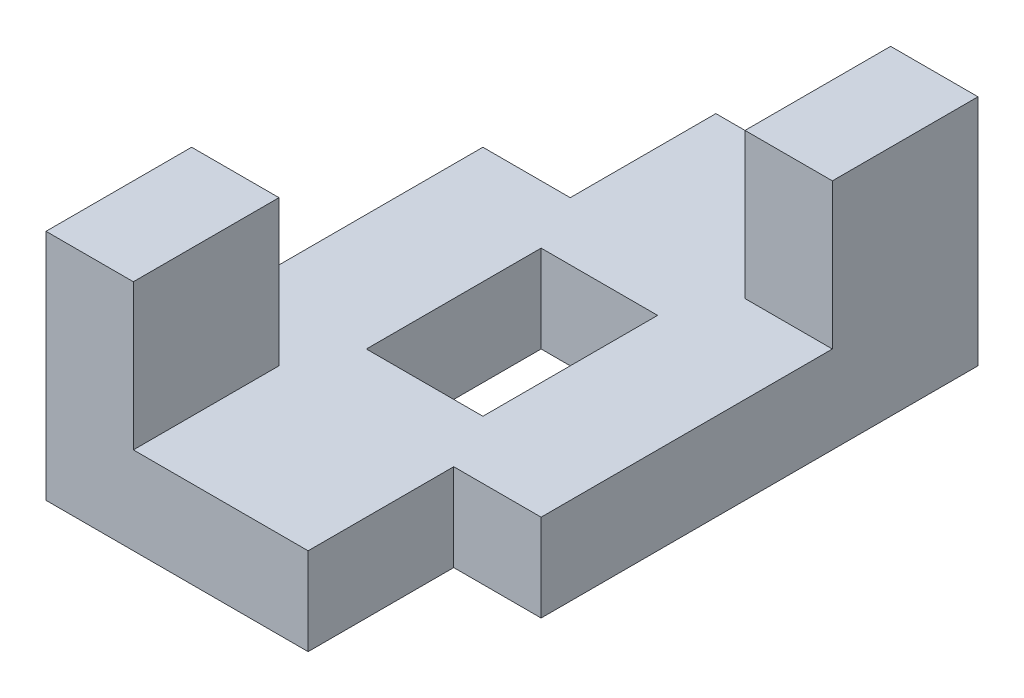
ISO-10303-21;
HEADER;
FILE_DESCRIPTION(('STEP AP214'),'2;1');
FILE_NAME('part.step','',(''),(''),'','','');
FILE_SCHEMA(('AUTOMOTIVE_DESIGN { 1 0 10303 214 1 1 1 1 }'));
ENDSEC;
DATA;
#1=APPLICATION_CONTEXT('core data for automotive mechanical design processes');
#2=APPLICATION_PROTOCOL_DEFINITION('international standard','automotive_design',2000,#1);
#3=PRODUCT_CONTEXT('',#1,'mechanical');
#4=PRODUCT('Part','Part','',(#3));
#5=PRODUCT_RELATED_PRODUCT_CATEGORY('part','',(#4));
#6=PRODUCT_DEFINITION_FORMATION('','',#4);
#7=PRODUCT_DEFINITION_CONTEXT('part definition',#1,'design');
#8=PRODUCT_DEFINITION('design','',#6,#7);
#9=PRODUCT_DEFINITION_SHAPE('','',#8);
#10=(LENGTH_UNIT() NAMED_UNIT(*) SI_UNIT(.MILLI.,.METRE.));
#11=(NAMED_UNIT(*) PLANE_ANGLE_UNIT() SI_UNIT($,.RADIAN.));
#12=(NAMED_UNIT(*) SI_UNIT($,.STERADIAN.) SOLID_ANGLE_UNIT());
#13=UNCERTAINTY_MEASURE_WITH_UNIT(LENGTH_MEASURE(1.E-05),#10,'distance_accuracy_value','');
#14=(GEOMETRIC_REPRESENTATION_CONTEXT(3) GLOBAL_UNCERTAINTY_ASSIGNED_CONTEXT((#13)) GLOBAL_UNIT_ASSIGNED_CONTEXT((#10,
#11,#12)) REPRESENTATION_CONTEXT('',''));
#15=CARTESIAN_POINT('',(0.,0.,0.));
#16=DIRECTION('',(0.,0.,1.));
#17=DIRECTION('',(1.,0.,0.));
#18=AXIS2_PLACEMENT_3D('',#15,#16,#17);
#19=CARTESIAN_POINT('',(15.,15.,0.));
#20=DIRECTION('',(-1.,0.,0.));
#21=DIRECTION('',(0.,0.,1.));
#22=AXIS2_PLACEMENT_3D('',#19,#20,#21);
#23=PLANE('',#22);
#24=DIRECTION('',(0.,0.,-1.));
#25=VECTOR('',#24,1.);
#26=CARTESIAN_POINT('',(15.,0.,0.));
#27=LINE('',#26,#25);
#28=CARTESIAN_POINT('',(15.,0.,-25.));
#29=VERTEX_POINT('',#28);
#30=CARTESIAN_POINT('',(15.,0.,-100.));
#31=VERTEX_POINT('',#30);
#32=EDGE_CURVE('E171',#29,#31,#27,.T.);
#33=ORIENTED_EDGE('',*,*,#32,.T.);
#34=DIRECTION('',(0.,-1.,0.));
#35=VECTOR('',#34,1.);
#36=CARTESIAN_POINT('',(15.,40.,-100.));
#37=LINE('',#36,#35);
#38=CARTESIAN_POINT('',(15.,40.,-100.));
#39=VERTEX_POINT('',#38);
#40=EDGE_CURVE('E373',#39,#31,#37,.T.);
#41=ORIENTED_EDGE('',*,*,#40,.F.);
#42=DIRECTION('',(0.,0.,-1.));
#43=VECTOR('',#42,1.);
#44=CARTESIAN_POINT('',(15.,40.,0.));
#45=LINE('',#44,#43);
#46=CARTESIAN_POINT('',(15.,40.,-75.));
#47=VERTEX_POINT('',#46);
#48=EDGE_CURVE('E283',#47,#39,#45,.T.);
#49=ORIENTED_EDGE('',*,*,#48,.F.);
#50=DIRECTION('',(0.,-1.,0.));
#51=VECTOR('',#50,1.);
#52=CARTESIAN_POINT('',(15.,40.,-75.));
#53=LINE('',#52,#51);
#54=CARTESIAN_POINT('',(15.,15.,-75.));
#55=VERTEX_POINT('',#54);
#56=EDGE_CURVE('E163',#47,#55,#53,.T.);
#57=ORIENTED_EDGE('',*,*,#56,.T.);
#58=DIRECTION('',(0.,0.,-1.));
#59=VECTOR('',#58,1.);
#60=CARTESIAN_POINT('',(15.,15.,0.));
#61=LINE('',#60,#59);
#62=CARTESIAN_POINT('',(15.,15.,-25.));
#63=VERTEX_POINT('',#62);
#64=EDGE_CURVE('E219',#63,#55,#61,.T.);
#65=ORIENTED_EDGE('',*,*,#64,.F.);
#66=DIRECTION('',(0.,-1.,0.));
#67=VECTOR('',#66,1.);
#68=CARTESIAN_POINT('',(15.,15.,-25.));
#69=LINE('',#68,#67);
#70=EDGE_CURVE('E187',#63,#29,#69,.T.);
#71=ORIENTED_EDGE('',*,*,#70,.T.);
#72=EDGE_LOOP('',(#33,#41,#49,#57,#65,#71));
#73=FACE_BOUND('',#72,.T.);
#74=ADVANCED_FACE('F41',(#73),#23,.F.);
#75=CARTESIAN_POINT('',(0.,15.,-100.));
#76=DIRECTION('',(0.,0.,1.));
#77=DIRECTION('',(1.,0.,0.));
#78=AXIS2_PLACEMENT_3D('',#75,#76,#77);
#79=PLANE('',#78);
#80=DIRECTION('',(-1.,0.,0.));
#81=VECTOR('',#80,1.);
#82=CARTESIAN_POINT('',(0.,0.,-100.));
#83=LINE('',#82,#81);
#84=CARTESIAN_POINT('',(-30.,0.,-100.));
#85=VERTEX_POINT('',#84);
#86=EDGE_CURVE('E174',#31,#85,#83,.T.);
#87=ORIENTED_EDGE('',*,*,#86,.T.);
#88=DIRECTION('',(0.,-1.,0.));
#89=VECTOR('',#88,1.);
#90=CARTESIAN_POINT('',(-30.,15.,-100.));
#91=LINE('',#90,#89);
#92=CARTESIAN_POINT('',(-30.,15.,-100.));
#93=VERTEX_POINT('',#92);
#94=EDGE_CURVE('E11',#93,#85,#91,.T.);
#95=ORIENTED_EDGE('',*,*,#94,.F.);
#96=DIRECTION('',(-1.,0.,0.));
#97=VECTOR('',#96,1.);
#98=CARTESIAN_POINT('',(0.,15.,-100.));
#99=LINE('',#98,#97);
#100=CARTESIAN_POINT('',(0.,15.,-100.));
#101=VERTEX_POINT('',#100);
#102=EDGE_CURVE('E232',#101,#93,#99,.T.);
#103=ORIENTED_EDGE('',*,*,#102,.F.);
#104=DIRECTION('',(0.,-1.,0.));
#105=VECTOR('',#104,1.);
#106=CARTESIAN_POINT('',(0.,40.,-100.));
#107=LINE('',#106,#105);
#108=CARTESIAN_POINT('',(0.,40.,-100.));
#109=VERTEX_POINT('',#108);
#110=EDGE_CURVE('E356',#109,#101,#107,.T.);
#111=ORIENTED_EDGE('',*,*,#110,.F.);
#112=DIRECTION('',(-1.,0.,0.));
#113=VECTOR('',#112,1.);
#114=CARTESIAN_POINT('',(0.,40.,-100.));
#115=LINE('',#114,#113);
#116=EDGE_CURVE('E402',#39,#109,#115,.T.);
#117=ORIENTED_EDGE('',*,*,#116,.F.);
#118=ORIENTED_EDGE('',*,*,#40,.T.);
#119=EDGE_LOOP('',(#87,#95,#103,#111,#117,#118));
#120=FACE_BOUND('',#119,.T.);
#121=ADVANCED_FACE('F300',(#120),#79,.F.);
#122=CARTESIAN_POINT('',(-30.,15.,0.));
#123=DIRECTION('',(1.,0.,0.));
#124=DIRECTION('',(0.,0.,-1.));
#125=AXIS2_PLACEMENT_3D('',#122,#123,#124);
#126=PLANE('',#125);
#127=DIRECTION('',(0.,0.,1.));
#128=VECTOR('',#127,1.);
#129=CARTESIAN_POINT('',(-30.,0.,0.));
#130=LINE('',#129,#128);
#131=CARTESIAN_POINT('',(-30.,0.,-75.));
#132=VERTEX_POINT('',#131);
#133=EDGE_CURVE('E176',#85,#132,#130,.T.);
#134=ORIENTED_EDGE('',*,*,#133,.T.);
#135=DIRECTION('',(0.,-1.,0.));
#136=VECTOR('',#135,1.);
#137=CARTESIAN_POINT('',(-30.,15.,-75.));
#138=LINE('',#137,#136);
#139=CARTESIAN_POINT('',(-30.,15.,-75.));
#140=VERTEX_POINT('',#139);
#141=EDGE_CURVE('E51',#140,#132,#138,.T.);
#142=ORIENTED_EDGE('',*,*,#141,.F.);
#143=DIRECTION('',(0.,0.,1.));
#144=VECTOR('',#143,1.);
#145=CARTESIAN_POINT('',(-30.,15.,0.));
#146=LINE('',#145,#144);
#147=EDGE_CURVE('E234',#93,#140,#146,.T.);
#148=ORIENTED_EDGE('',*,*,#147,.F.);
#149=ORIENTED_EDGE('',*,*,#94,.T.);
#150=EDGE_LOOP('',(#134,#142,#148,#149));
#151=FACE_BOUND('',#150,.T.);
#152=ADVANCED_FACE('F306',(#151),#126,.F.);
#153=CARTESIAN_POINT('',(0.,15.,-75.));
#154=DIRECTION('',(0.,0.,1.));
#155=DIRECTION('',(1.,0.,0.));
#156=AXIS2_PLACEMENT_3D('',#153,#154,#155);
#157=PLANE('',#156);
#158=DIRECTION('',(-1.,0.,0.));
#159=VECTOR('',#158,1.);
#160=CARTESIAN_POINT('',(0.,0.,-75.));
#161=LINE('',#160,#159);
#162=CARTESIAN_POINT('',(-45.,0.,-75.));
#163=VERTEX_POINT('',#162);
#164=EDGE_CURVE('E178',#132,#163,#161,.T.);
#165=ORIENTED_EDGE('',*,*,#164,.T.);
#166=DIRECTION('',(0.,-1.,0.));
#167=VECTOR('',#166,1.);
#168=CARTESIAN_POINT('',(-45.,15.,-75.));
#169=LINE('',#168,#167);
#170=CARTESIAN_POINT('',(-45.,15.,-75.));
#171=VERTEX_POINT('',#170);
#172=EDGE_CURVE('E150',#171,#163,#169,.T.);
#173=ORIENTED_EDGE('',*,*,#172,.F.);
#174=DIRECTION('',(-1.,0.,0.));
#175=VECTOR('',#174,1.);
#176=CARTESIAN_POINT('',(0.,15.,-75.));
#177=LINE('',#176,#175);
#178=EDGE_CURVE('E236',#140,#171,#177,.T.);
#179=ORIENTED_EDGE('',*,*,#178,.F.);
#180=ORIENTED_EDGE('',*,*,#141,.T.);
#181=EDGE_LOOP('',(#165,#173,#179,#180));
#182=FACE_BOUND('',#181,.T.);
#183=ADVANCED_FACE('F329',(#182),#157,.F.);
#184=CARTESIAN_POINT('',(-45.,15.,0.));
#185=DIRECTION('',(1.,0.,0.));
#186=DIRECTION('',(0.,0.,-1.));
#187=AXIS2_PLACEMENT_3D('',#184,#185,#186);
#188=PLANE('',#187);
#189=DIRECTION('',(0.,0.,1.));
#190=VECTOR('',#189,1.);
#191=CARTESIAN_POINT('',(-45.,0.,0.));
#192=LINE('',#191,#190);
#193=CARTESIAN_POINT('',(-45.,0.,0.));
#194=VERTEX_POINT('',#193);
#195=EDGE_CURVE('E180',#163,#194,#192,.T.);
#196=ORIENTED_EDGE('',*,*,#195,.T.);
#197=DIRECTION('',(0.,-1.,0.));
#198=VECTOR('',#197,1.);
#199=CARTESIAN_POINT('',(-45.,40.,0.));
#200=LINE('',#199,#198);
#201=CARTESIAN_POINT('',(-45.,40.,0.));
#202=VERTEX_POINT('',#201);
#203=EDGE_CURVE('E280',#202,#194,#200,.T.);
#204=ORIENTED_EDGE('',*,*,#203,.F.);
#205=DIRECTION('',(0.,0.,1.));
#206=VECTOR('',#205,1.);
#207=CARTESIAN_POINT('',(-45.,40.,0.));
#208=LINE('',#207,#206);
#209=CARTESIAN_POINT('',(-45.,40.,-25.));
#210=VERTEX_POINT('',#209);
#211=EDGE_CURVE('E278',#210,#202,#208,.T.);
#212=ORIENTED_EDGE('',*,*,#211,.F.);
#213=DIRECTION('',(0.,-1.,0.));
#214=VECTOR('',#213,1.);
#215=CARTESIAN_POINT('',(-45.,40.,-25.));
#216=LINE('',#215,#214);
#217=CARTESIAN_POINT('',(-45.,15.,-25.));
#218=VERTEX_POINT('',#217);
#219=EDGE_CURVE('E274',#210,#218,#216,.T.);
#220=ORIENTED_EDGE('',*,*,#219,.T.);
#221=DIRECTION('',(0.,0.,1.));
#222=VECTOR('',#221,1.);
#223=CARTESIAN_POINT('',(-45.,15.,0.));
#224=LINE('',#223,#222);
#225=EDGE_CURVE('E238',#171,#218,#224,.T.);
#226=ORIENTED_EDGE('',*,*,#225,.F.);
#227=ORIENTED_EDGE('',*,*,#172,.T.);
#228=EDGE_LOOP('',(#196,#204,#212,#220,#226,#227));
#229=FACE_BOUND('',#228,.T.);
#230=ADVANCED_FACE('F271',(#229),#188,.F.);
#231=CARTESIAN_POINT('',(0.,15.,0.));
#232=DIRECTION('',(0.,0.,-1.));
#233=DIRECTION('',(-1.,0.,0.));
#234=AXIS2_PLACEMENT_3D('',#231,#232,#233);
#235=PLANE('',#234);
#236=DIRECTION('',(1.,0.,0.));
#237=VECTOR('',#236,1.);
#238=CARTESIAN_POINT('',(0.,0.,0.));
#239=LINE('',#238,#237);
#240=CARTESIAN_POINT('',(0.,0.,0.));
#241=VERTEX_POINT('',#240);
#242=EDGE_CURVE('E149',#194,#241,#239,.T.);
#243=ORIENTED_EDGE('',*,*,#242,.T.);
#244=DIRECTION('',(0.,-1.,0.));
#245=VECTOR('',#244,1.);
#246=CARTESIAN_POINT('',(0.,15.,0.));
#247=LINE('',#246,#245);
#248=CARTESIAN_POINT('',(0.,15.,0.));
#249=VERTEX_POINT('',#248);
#250=EDGE_CURVE('E145',#249,#241,#247,.T.);
#251=ORIENTED_EDGE('',*,*,#250,.F.);
#252=DIRECTION('',(1.,0.,0.));
#253=VECTOR('',#252,1.);
#254=CARTESIAN_POINT('',(0.,15.,0.));
#255=LINE('',#254,#253);
#256=CARTESIAN_POINT('',(-30.,15.,0.));
#257=VERTEX_POINT('',#256);
#258=EDGE_CURVE('E133',#257,#249,#255,.T.);
#259=ORIENTED_EDGE('',*,*,#258,.F.);
#260=DIRECTION('',(0.,-1.,0.));
#261=VECTOR('',#260,1.);
#262=CARTESIAN_POINT('',(-30.,40.,0.));
#263=LINE('',#262,#261);
#264=CARTESIAN_POINT('',(-30.,40.,0.));
#265=VERTEX_POINT('',#264);
#266=EDGE_CURVE('E252',#265,#257,#263,.T.);
#267=ORIENTED_EDGE('',*,*,#266,.F.);
#268=DIRECTION('',(1.,0.,0.));
#269=VECTOR('',#268,1.);
#270=CARTESIAN_POINT('',(0.,40.,0.));
#271=LINE('',#270,#269);
#272=EDGE_CURVE('E381',#202,#265,#271,.T.);
#273=ORIENTED_EDGE('',*,*,#272,.F.);
#274=ORIENTED_EDGE('',*,*,#203,.T.);
#275=EDGE_LOOP('',(#243,#251,#259,#267,#273,#274));
#276=FACE_BOUND('',#275,.T.);
#277=ADVANCED_FACE('F146',(#276),#235,.F.);
#278=CARTESIAN_POINT('',(0.,15.,0.));
#279=DIRECTION('',(-1.,0.,0.));
#280=DIRECTION('',(0.,0.,1.));
#281=AXIS2_PLACEMENT_3D('',#278,#279,#280);
#282=PLANE('',#281);
#283=DIRECTION('',(0.,0.,-1.));
#284=VECTOR('',#283,1.);
#285=CARTESIAN_POINT('',(0.,0.,0.));
#286=LINE('',#285,#284);
#287=CARTESIAN_POINT('',(0.,0.,-25.));
#288=VERTEX_POINT('',#287);
#289=EDGE_CURVE('E96',#241,#288,#286,.T.);
#290=ORIENTED_EDGE('',*,*,#289,.T.);
#291=DIRECTION('',(0.,-1.,0.));
#292=VECTOR('',#291,1.);
#293=CARTESIAN_POINT('',(0.,15.,-25.));
#294=LINE('',#293,#292);
#295=CARTESIAN_POINT('',(0.,15.,-25.));
#296=VERTEX_POINT('',#295);
#297=EDGE_CURVE('E151',#296,#288,#294,.T.);
#298=ORIENTED_EDGE('',*,*,#297,.F.);
#299=DIRECTION('',(0.,0.,-1.));
#300=VECTOR('',#299,1.);
#301=CARTESIAN_POINT('',(0.,15.,0.));
#302=LINE('',#301,#300);
#303=EDGE_CURVE('E137',#249,#296,#302,.T.);
#304=ORIENTED_EDGE('',*,*,#303,.F.);
#305=ORIENTED_EDGE('',*,*,#250,.T.);
#306=EDGE_LOOP('',(#290,#298,#304,#305));
#307=FACE_BOUND('',#306,.T.);
#308=ADVANCED_FACE('F153',(#307),#282,.F.);
#309=CARTESIAN_POINT('',(0.,15.,-65.));
#310=DIRECTION('',(0.,0.,1.));
#311=DIRECTION('',(1.,0.,0.));
#312=AXIS2_PLACEMENT_3D('',#309,#310,#311);
#313=PLANE('',#312);
#314=DIRECTION('',(-1.,0.,0.));
#315=VECTOR('',#314,1.);
#316=CARTESIAN_POINT('',(0.,0.,-65.));
#317=LINE('',#316,#315);
#318=CARTESIAN_POINT('',(-5.00000000000002,0.,-65.));
#319=VERTEX_POINT('',#318);
#320=CARTESIAN_POINT('',(-25.,0.,-65.));
#321=VERTEX_POINT('',#320);
#322=EDGE_CURVE('E159',#319,#321,#317,.T.);
#323=ORIENTED_EDGE('',*,*,#322,.F.);
#324=DIRECTION('',(0.,-1.,0.));
#325=VECTOR('',#324,1.);
#326=CARTESIAN_POINT('',(-5.00000000000002,15.,-65.));
#327=LINE('',#326,#325);
#328=CARTESIAN_POINT('',(-5.00000000000002,15.,-65.));
#329=VERTEX_POINT('',#328);
#330=EDGE_CURVE('E45',#329,#319,#327,.T.);
#331=ORIENTED_EDGE('',*,*,#330,.F.);
#332=DIRECTION('',(-1.,0.,0.));
#333=VECTOR('',#332,1.);
#334=CARTESIAN_POINT('',(0.,15.,-65.));
#335=LINE('',#334,#333);
#336=CARTESIAN_POINT('',(-25.,15.,-65.));
#337=VERTEX_POINT('',#336);
#338=EDGE_CURVE('E186',#329,#337,#335,.T.);
#339=ORIENTED_EDGE('',*,*,#338,.T.);
#340=DIRECTION('',(0.,-1.,0.));
#341=VECTOR('',#340,1.);
#342=CARTESIAN_POINT('',(-25.,15.,-65.));
#343=LINE('',#342,#341);
#344=EDGE_CURVE('E155',#337,#321,#343,.T.);
#345=ORIENTED_EDGE('',*,*,#344,.T.);
#346=EDGE_LOOP('',(#323,#331,#339,#345));
#347=FACE_BOUND('',#346,.T.);
#348=ADVANCED_FACE('F43',(#347),#313,.T.);
#349=CARTESIAN_POINT('',(-4.99999999999997,15.,0.));
#350=DIRECTION('',(-1.,0.,0.));
#351=DIRECTION('',(0.,0.,1.));
#352=AXIS2_PLACEMENT_3D('',#349,#350,#351);
#353=PLANE('',#352);
#354=DIRECTION('',(0.,0.,-1.));
#355=VECTOR('',#354,1.);
#356=CARTESIAN_POINT('',(-4.99999999999997,0.,0.));
#357=LINE('',#356,#355);
#358=CARTESIAN_POINT('',(-5.,0.,-35.));
#359=VERTEX_POINT('',#358);
#360=EDGE_CURVE('E162',#359,#319,#357,.T.);
#361=ORIENTED_EDGE('',*,*,#360,.F.);
#362=DIRECTION('',(0.,-1.,0.));
#363=VECTOR('',#362,1.);
#364=CARTESIAN_POINT('',(-5.,15.,-35.));
#365=LINE('',#364,#363);
#366=CARTESIAN_POINT('',(-5.,15.,-35.));
#367=VERTEX_POINT('',#366);
#368=EDGE_CURVE('E197',#367,#359,#365,.T.);
#369=ORIENTED_EDGE('',*,*,#368,.F.);
#370=DIRECTION('',(0.,0.,-1.));
#371=VECTOR('',#370,1.);
#372=CARTESIAN_POINT('',(-4.99999999999997,15.,0.));
#373=LINE('',#372,#371);
#374=EDGE_CURVE('E206',#367,#329,#373,.T.);
#375=ORIENTED_EDGE('',*,*,#374,.T.);
#376=ORIENTED_EDGE('',*,*,#330,.T.);
#377=EDGE_LOOP('',(#361,#369,#375,#376));
#378=FACE_BOUND('',#377,.T.);
#379=ADVANCED_FACE('F204',(#378),#353,.T.);
#380=CARTESIAN_POINT('',(0.,15.,-35.));
#381=DIRECTION('',(0.,0.,1.));
#382=DIRECTION('',(1.,0.,0.));
#383=AXIS2_PLACEMENT_3D('',#380,#381,#382);
#384=PLANE('',#383);
#385=DIRECTION('',(-1.,0.,0.));
#386=VECTOR('',#385,1.);
#387=CARTESIAN_POINT('',(0.,0.,-35.));
#388=LINE('',#387,#386);
#389=CARTESIAN_POINT('',(-25.,0.,-35.));
#390=VERTEX_POINT('',#389);
#391=EDGE_CURVE('E166',#359,#390,#388,.T.);
#392=ORIENTED_EDGE('',*,*,#391,.T.);
#393=DIRECTION('',(0.,-1.,0.));
#394=VECTOR('',#393,1.);
#395=CARTESIAN_POINT('',(-25.,15.,-35.));
#396=LINE('',#395,#394);
#397=CARTESIAN_POINT('',(-25.,15.,-35.));
#398=VERTEX_POINT('',#397);
#399=EDGE_CURVE('E195',#398,#390,#396,.T.);
#400=ORIENTED_EDGE('',*,*,#399,.F.);
#401=DIRECTION('',(-1.,0.,0.));
#402=VECTOR('',#401,1.);
#403=CARTESIAN_POINT('',(0.,15.,-35.));
#404=LINE('',#403,#402);
#405=EDGE_CURVE('E220',#367,#398,#404,.T.);
#406=ORIENTED_EDGE('',*,*,#405,.F.);
#407=ORIENTED_EDGE('',*,*,#368,.T.);
#408=EDGE_LOOP('',(#392,#400,#406,#407));
#409=FACE_BOUND('',#408,.T.);
#410=ADVANCED_FACE('F213',(#409),#384,.F.);
#411=CARTESIAN_POINT('',(-25.,15.,0.));
#412=DIRECTION('',(-1.,0.,0.));
#413=DIRECTION('',(0.,0.,1.));
#414=AXIS2_PLACEMENT_3D('',#411,#412,#413);
#415=PLANE('',#414);
#416=DIRECTION('',(0.,0.,-1.));
#417=VECTOR('',#416,1.);
#418=CARTESIAN_POINT('',(-25.,0.,0.));
#419=LINE('',#418,#417);
#420=EDGE_CURVE('E168',#390,#321,#419,.T.);
#421=ORIENTED_EDGE('',*,*,#420,.T.);
#422=ORIENTED_EDGE('',*,*,#344,.F.);
#423=DIRECTION('',(0.,0.,-1.));
#424=VECTOR('',#423,1.);
#425=CARTESIAN_POINT('',(-25.,15.,0.));
#426=LINE('',#425,#424);
#427=EDGE_CURVE('E217',#398,#337,#426,.T.);
#428=ORIENTED_EDGE('',*,*,#427,.F.);
#429=ORIENTED_EDGE('',*,*,#399,.T.);
#430=EDGE_LOOP('',(#421,#422,#428,#429));
#431=FACE_BOUND('',#430,.T.);
#432=ADVANCED_FACE('F216',(#431),#415,.F.);
#433=CARTESIAN_POINT('',(0.,15.,-25.));
#434=DIRECTION('',(0.,0.,-1.));
#435=DIRECTION('',(-1.,0.,0.));
#436=AXIS2_PLACEMENT_3D('',#433,#434,#435);
#437=PLANE('',#436);
#438=DIRECTION('',(1.,0.,0.));
#439=VECTOR('',#438,1.);
#440=CARTESIAN_POINT('',(0.,0.,-25.));
#441=LINE('',#440,#439);
#442=EDGE_CURVE('E102',#288,#29,#441,.T.);
#443=ORIENTED_EDGE('',*,*,#442,.T.);
#444=ORIENTED_EDGE('',*,*,#70,.F.);
#445=DIRECTION('',(1.,0.,0.));
#446=VECTOR('',#445,1.);
#447=CARTESIAN_POINT('',(0.,15.,-25.));
#448=LINE('',#447,#446);
#449=EDGE_CURVE('E60',#296,#63,#448,.T.);
#450=ORIENTED_EDGE('',*,*,#449,.F.);
#451=ORIENTED_EDGE('',*,*,#297,.T.);
#452=EDGE_LOOP('',(#443,#444,#450,#451));
#453=FACE_BOUND('',#452,.T.);
#454=ADVANCED_FACE('F289',(#453),#437,.F.);
#455=CARTESIAN_POINT('',(0.,15.,0.));
#456=DIRECTION('',(0.,1.,0.));
#457=DIRECTION('',(0.,0.,1.));
#458=AXIS2_PLACEMENT_3D('',#455,#456,#457);
#459=PLANE('',#458);
#460=ORIENTED_EDGE('',*,*,#338,.F.);
#461=ORIENTED_EDGE('',*,*,#374,.F.);
#462=ORIENTED_EDGE('',*,*,#405,.T.);
#463=ORIENTED_EDGE('',*,*,#427,.T.);
#464=EDGE_LOOP('',(#460,#461,#462,#463));
#465=FACE_BOUND('',#464,.T.);
#466=ORIENTED_EDGE('',*,*,#64,.T.);
#467=DIRECTION('',(-1.,0.,0.));
#468=VECTOR('',#467,1.);
#469=CARTESIAN_POINT('',(0.,15.,-75.));
#470=LINE('',#469,#468);
#471=CARTESIAN_POINT('',(0.,15.,-75.));
#472=VERTEX_POINT('',#471);
#473=EDGE_CURVE('E222',#55,#472,#470,.T.);
#474=ORIENTED_EDGE('',*,*,#473,.T.);
#475=DIRECTION('',(0.,0.,1.));
#476=VECTOR('',#475,1.);
#477=CARTESIAN_POINT('',(0.,15.,0.));
#478=LINE('',#477,#476);
#479=EDGE_CURVE('E229',#101,#472,#478,.T.);
#480=ORIENTED_EDGE('',*,*,#479,.F.);
#481=ORIENTED_EDGE('',*,*,#102,.T.);
#482=ORIENTED_EDGE('',*,*,#147,.T.);
#483=ORIENTED_EDGE('',*,*,#178,.T.);
#484=ORIENTED_EDGE('',*,*,#225,.T.);
#485=DIRECTION('',(1.,0.,0.));
#486=VECTOR('',#485,1.);
#487=CARTESIAN_POINT('',(0.,15.,-25.));
#488=LINE('',#487,#486);
#489=CARTESIAN_POINT('',(-30.,15.,-25.));
#490=VERTEX_POINT('',#489);
#491=EDGE_CURVE('E241',#218,#490,#488,.T.);
#492=ORIENTED_EDGE('',*,*,#491,.T.);
#493=DIRECTION('',(0.,0.,-1.));
#494=VECTOR('',#493,1.);
#495=CARTESIAN_POINT('',(-30.,15.,0.));
#496=LINE('',#495,#494);
#497=EDGE_CURVE('E141',#257,#490,#496,.T.);
#498=ORIENTED_EDGE('',*,*,#497,.F.);
#499=ORIENTED_EDGE('',*,*,#258,.T.);
#500=ORIENTED_EDGE('',*,*,#303,.T.);
#501=ORIENTED_EDGE('',*,*,#449,.T.);
#502=EDGE_LOOP('',(#466,#474,#480,#481,#482,#483,#484,#492,#498,#499,#500,#501));
#503=FACE_BOUND('',#502,.T.);
#504=ADVANCED_FACE('F135',(#465,#503),#459,.T.);
#505=CARTESIAN_POINT('',(0.,0.,0.));
#506=DIRECTION('',(0.,1.,0.));
#507=DIRECTION('',(0.,0.,1.));
#508=AXIS2_PLACEMENT_3D('',#505,#506,#507);
#509=PLANE('',#508);
#510=ORIENTED_EDGE('',*,*,#322,.T.);
#511=ORIENTED_EDGE('',*,*,#420,.F.);
#512=ORIENTED_EDGE('',*,*,#391,.F.);
#513=ORIENTED_EDGE('',*,*,#360,.T.);
#514=EDGE_LOOP('',(#510,#511,#512,#513));
#515=FACE_BOUND('',#514,.T.);
#516=ORIENTED_EDGE('',*,*,#32,.F.);
#517=ORIENTED_EDGE('',*,*,#442,.F.);
#518=ORIENTED_EDGE('',*,*,#289,.F.);
#519=ORIENTED_EDGE('',*,*,#242,.F.);
#520=ORIENTED_EDGE('',*,*,#195,.F.);
#521=ORIENTED_EDGE('',*,*,#164,.F.);
#522=ORIENTED_EDGE('',*,*,#133,.F.);
#523=ORIENTED_EDGE('',*,*,#86,.F.);
#524=EDGE_LOOP('',(#516,#517,#518,#519,#520,#521,#522,#523));
#525=FACE_BOUND('',#524,.T.);
#526=ADVANCED_FACE('F210',(#515,#525),#509,.F.);
#527=CARTESIAN_POINT('',(0.,40.,-25.));
#528=DIRECTION('',(0.,0.,-1.));
#529=DIRECTION('',(-1.,0.,0.));
#530=AXIS2_PLACEMENT_3D('',#527,#528,#529);
#531=PLANE('',#530);
#532=DIRECTION('',(0.,-1.,0.));
#533=VECTOR('',#532,1.);
#534=CARTESIAN_POINT('',(-30.,40.,-25.));
#535=LINE('',#534,#533);
#536=CARTESIAN_POINT('',(-30.,40.,-25.));
#537=VERTEX_POINT('',#536);
#538=EDGE_CURVE('E250',#537,#490,#535,.T.);
#539=ORIENTED_EDGE('',*,*,#538,.T.);
#540=ORIENTED_EDGE('',*,*,#491,.F.);
#541=ORIENTED_EDGE('',*,*,#219,.F.);
#542=DIRECTION('',(1.,0.,0.));
#543=VECTOR('',#542,1.);
#544=CARTESIAN_POINT('',(0.,40.,-25.));
#545=LINE('',#544,#543);
#546=EDGE_CURVE('E262',#210,#537,#545,.T.);
#547=ORIENTED_EDGE('',*,*,#546,.T.);
#548=EDGE_LOOP('',(#539,#540,#541,#547));
#549=FACE_BOUND('',#548,.T.);
#550=ADVANCED_FACE('F257',(#549),#531,.T.);
#551=CARTESIAN_POINT('',(-30.,40.,0.));
#552=DIRECTION('',(-1.,0.,0.));
#553=DIRECTION('',(0.,0.,1.));
#554=AXIS2_PLACEMENT_3D('',#551,#552,#553);
#555=PLANE('',#554);
#556=ORIENTED_EDGE('',*,*,#497,.T.);
#557=ORIENTED_EDGE('',*,*,#538,.F.);
#558=DIRECTION('',(0.,0.,-1.));
#559=VECTOR('',#558,1.);
#560=CARTESIAN_POINT('',(-30.,40.,0.));
#561=LINE('',#560,#559);
#562=EDGE_CURVE('E263',#265,#537,#561,.T.);
#563=ORIENTED_EDGE('',*,*,#562,.F.);
#564=ORIENTED_EDGE('',*,*,#266,.T.);
#565=EDGE_LOOP('',(#556,#557,#563,#564));
#566=FACE_BOUND('',#565,.T.);
#567=ADVANCED_FACE('F247',(#566),#555,.F.);
#568=CARTESIAN_POINT('',(0.,40.,0.));
#569=DIRECTION('',(0.,1.,0.));
#570=DIRECTION('',(0.,0.,1.));
#571=AXIS2_PLACEMENT_3D('',#568,#569,#570);
#572=PLANE('',#571);
#573=ORIENTED_EDGE('',*,*,#546,.F.);
#574=ORIENTED_EDGE('',*,*,#211,.T.);
#575=ORIENTED_EDGE('',*,*,#272,.T.);
#576=ORIENTED_EDGE('',*,*,#562,.T.);
#577=EDGE_LOOP('',(#573,#574,#575,#576));
#578=FACE_BOUND('',#577,.T.);
#579=ADVANCED_FACE('F386',(#578),#572,.T.);
#580=CARTESIAN_POINT('',(0.,40.,-75.));
#581=DIRECTION('',(0.,0.,1.));
#582=DIRECTION('',(1.,0.,0.));
#583=AXIS2_PLACEMENT_3D('',#580,#581,#582);
#584=PLANE('',#583);
#585=DIRECTION('',(0.,-1.,0.));
#586=VECTOR('',#585,1.);
#587=CARTESIAN_POINT('',(0.,40.,-75.));
#588=LINE('',#587,#586);
#589=CARTESIAN_POINT('',(0.,40.,-75.));
#590=VERTEX_POINT('',#589);
#591=EDGE_CURVE('E367',#590,#472,#588,.T.);
#592=ORIENTED_EDGE('',*,*,#591,.T.);
#593=ORIENTED_EDGE('',*,*,#473,.F.);
#594=ORIENTED_EDGE('',*,*,#56,.F.);
#595=DIRECTION('',(-1.,0.,0.));
#596=VECTOR('',#595,1.);
#597=CARTESIAN_POINT('',(0.,40.,-75.));
#598=LINE('',#597,#596);
#599=EDGE_CURVE('E279',#47,#590,#598,.T.);
#600=ORIENTED_EDGE('',*,*,#599,.T.);
#601=EDGE_LOOP('',(#592,#593,#594,#600));
#602=FACE_BOUND('',#601,.T.);
#603=ADVANCED_FACE('F363',(#602),#584,.T.);
#604=CARTESIAN_POINT('',(0.,40.,0.));
#605=DIRECTION('',(1.,0.,0.));
#606=DIRECTION('',(0.,0.,-1.));
#607=AXIS2_PLACEMENT_3D('',#604,#605,#606);
#608=PLANE('',#607);
#609=ORIENTED_EDGE('',*,*,#479,.T.);
#610=ORIENTED_EDGE('',*,*,#591,.F.);
#611=DIRECTION('',(0.,0.,1.));
#612=VECTOR('',#611,1.);
#613=CARTESIAN_POINT('',(0.,40.,0.));
#614=LINE('',#613,#612);
#615=EDGE_CURVE('E404',#109,#590,#614,.T.);
#616=ORIENTED_EDGE('',*,*,#615,.F.);
#617=ORIENTED_EDGE('',*,*,#110,.T.);
#618=EDGE_LOOP('',(#609,#610,#616,#617));
#619=FACE_BOUND('',#618,.T.);
#620=ADVANCED_FACE('F408',(#619),#608,.F.);
#621=CARTESIAN_POINT('',(0.,40.,0.));
#622=DIRECTION('',(0.,1.,0.));
#623=DIRECTION('',(0.,0.,1.));
#624=AXIS2_PLACEMENT_3D('',#621,#622,#623);
#625=PLANE('',#624);
#626=ORIENTED_EDGE('',*,*,#599,.F.);
#627=ORIENTED_EDGE('',*,*,#48,.T.);
#628=ORIENTED_EDGE('',*,*,#116,.T.);
#629=ORIENTED_EDGE('',*,*,#615,.T.);
#630=EDGE_LOOP('',(#626,#627,#628,#629));
#631=FACE_BOUND('',#630,.T.);
#632=ADVANCED_FACE('F400',(#631),#625,.T.);
#633=CLOSED_SHELL('',(#74,#121,#152,#183,#230,#277,#308,#348,#379,#410,#432,#454,#504,#526,#550,
#567,#579,#603,#620,#632));
#634=MANIFOLD_SOLID_BREP('B2',#633);
#635=ADVANCED_BREP_SHAPE_REPRESENTATION('',(#18,#634),#14);
#636=SHAPE_DEFINITION_REPRESENTATION(#9,#635);
ENDSEC;
END-ISO-10303-21;
